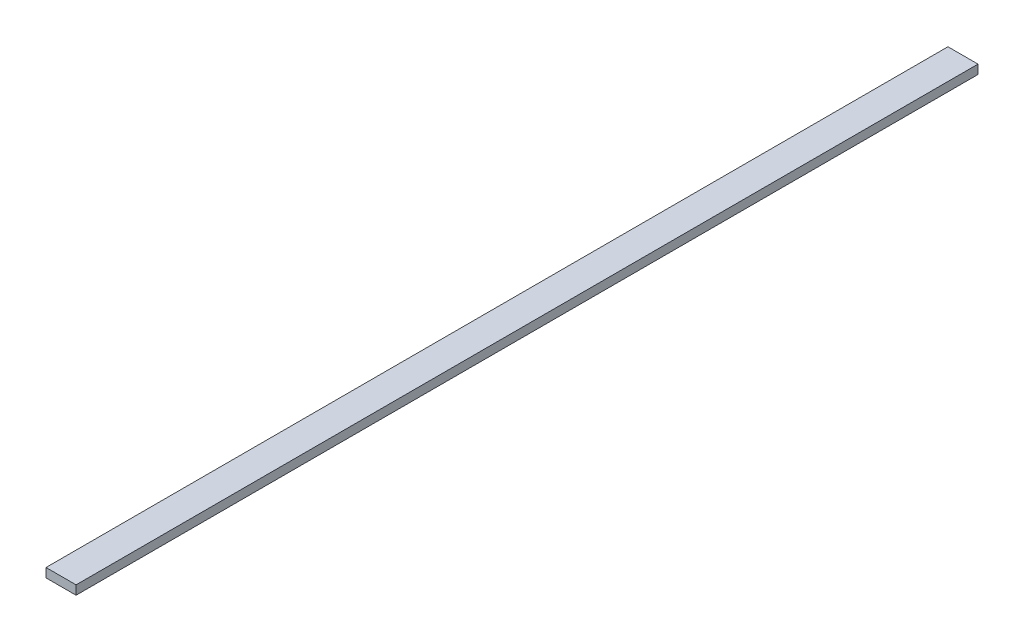
ISO-10303-21;
HEADER;
FILE_DESCRIPTION(('STEP AP214'),'2;1');
FILE_NAME('part.step','',(''),(''),'','','');
FILE_SCHEMA(('AUTOMOTIVE_DESIGN { 1 0 10303 214 1 1 1 1 }'));
ENDSEC;
DATA;
#1=APPLICATION_CONTEXT('core data for automotive mechanical design processes');
#2=APPLICATION_PROTOCOL_DEFINITION('international standard','automotive_design',2000,#1);
#3=PRODUCT_CONTEXT('',#1,'mechanical');
#4=PRODUCT('Part','Part','',(#3));
#5=PRODUCT_RELATED_PRODUCT_CATEGORY('part','',(#4));
#6=PRODUCT_DEFINITION_FORMATION('','',#4);
#7=PRODUCT_DEFINITION_CONTEXT('part definition',#1,'design');
#8=PRODUCT_DEFINITION('design','',#6,#7);
#9=PRODUCT_DEFINITION_SHAPE('','',#8);
#10=(LENGTH_UNIT() NAMED_UNIT(*) SI_UNIT(.MILLI.,.METRE.));
#11=(NAMED_UNIT(*) PLANE_ANGLE_UNIT() SI_UNIT($,.RADIAN.));
#12=(NAMED_UNIT(*) SI_UNIT($,.STERADIAN.) SOLID_ANGLE_UNIT());
#13=UNCERTAINTY_MEASURE_WITH_UNIT(LENGTH_MEASURE(1.E-05),#10,'distance_accuracy_value','');
#14=(GEOMETRIC_REPRESENTATION_CONTEXT(3) GLOBAL_UNCERTAINTY_ASSIGNED_CONTEXT((#13)) GLOBAL_UNIT_ASSIGNED_CONTEXT((#10,
#11,#12)) REPRESENTATION_CONTEXT('',''));
#15=CARTESIAN_POINT('',(0.,0.,0.));
#16=DIRECTION('',(0.,0.,1.));
#17=DIRECTION('',(1.,0.,0.));
#18=AXIS2_PLACEMENT_3D('',#15,#16,#17);
#19=CARTESIAN_POINT('',(-23.6537841965188,3.,-47.699620064803));
#20=DIRECTION('',(1.,0.,0.));
#21=DIRECTION('',(0.,0.,-1.));
#22=AXIS2_PLACEMENT_3D('',#19,#20,#21);
#23=PLANE('',#22);
#24=DIRECTION('',(0.,0.,1.));
#25=VECTOR('',#24,1.);
#26=CARTESIAN_POINT('',(-23.6537841965188,0.,-47.699620064803));
#27=LINE('',#26,#25);
#28=CARTESIAN_POINT('',(-23.6537841965188,0.,-47.699620064803));
#29=VERTEX_POINT('',#28);
#30=CARTESIAN_POINT('',(-23.6537841965188,0.,252.300379935197));
#31=VERTEX_POINT('',#30);
#32=EDGE_CURVE('E104',#29,#31,#27,.T.);
#33=ORIENTED_EDGE('',*,*,#32,.T.);
#34=DIRECTION('',(0.,-1.,0.));
#35=VECTOR('',#34,1.);
#36=CARTESIAN_POINT('',(-23.6537841965188,3.,252.300379935197));
#37=LINE('',#36,#35);
#38=CARTESIAN_POINT('',(-23.6537841965188,3.,252.300379935197));
#39=VERTEX_POINT('',#38);
#40=EDGE_CURVE('E11',#39,#31,#37,.T.);
#41=ORIENTED_EDGE('',*,*,#40,.F.);
#42=DIRECTION('',(0.,0.,1.));
#43=VECTOR('',#42,1.);
#44=CARTESIAN_POINT('',(-23.6537841965188,3.,-47.699620064803));
#45=LINE('',#44,#43);
#46=CARTESIAN_POINT('',(-23.6537841965188,3.,-47.699620064803));
#47=VERTEX_POINT('',#46);
#48=EDGE_CURVE('E92',#47,#39,#45,.T.);
#49=ORIENTED_EDGE('',*,*,#48,.F.);
#50=DIRECTION('',(0.,-1.,0.));
#51=VECTOR('',#50,1.);
#52=CARTESIAN_POINT('',(-23.6537841965188,3.,-47.699620064803));
#53=LINE('',#52,#51);
#54=EDGE_CURVE('E100',#47,#29,#53,.T.);
#55=ORIENTED_EDGE('',*,*,#54,.T.);
#56=EDGE_LOOP('',(#33,#41,#49,#55));
#57=FACE_BOUND('',#56,.T.);
#58=ADVANCED_FACE('F41',(#57),#23,.F.);
#59=CARTESIAN_POINT('',(-23.6537841965188,3.,252.300379935197));
#60=DIRECTION('',(0.,0.,-1.));
#61=DIRECTION('',(-1.,0.,0.));
#62=AXIS2_PLACEMENT_3D('',#59,#60,#61);
#63=PLANE('',#62);
#64=DIRECTION('',(1.,0.,0.));
#65=VECTOR('',#64,1.);
#66=CARTESIAN_POINT('',(-23.6537841965188,0.,252.300379935197));
#67=LINE('',#66,#65);
#68=CARTESIAN_POINT('',(-13.6537841965188,0.,252.300379935197));
#69=VERTEX_POINT('',#68);
#70=EDGE_CURVE('E96',#31,#69,#67,.T.);
#71=ORIENTED_EDGE('',*,*,#70,.T.);
#72=DIRECTION('',(0.,-1.,0.));
#73=VECTOR('',#72,1.);
#74=CARTESIAN_POINT('',(-13.6537841965188,3.,252.300379935197));
#75=LINE('',#74,#73);
#76=CARTESIAN_POINT('',(-13.6537841965188,3.,252.300379935197));
#77=VERTEX_POINT('',#76);
#78=EDGE_CURVE('E49',#77,#69,#75,.T.);
#79=ORIENTED_EDGE('',*,*,#78,.F.);
#80=DIRECTION('',(1.,0.,0.));
#81=VECTOR('',#80,1.);
#82=CARTESIAN_POINT('',(-23.6537841965188,3.,252.300379935197));
#83=LINE('',#82,#81);
#84=EDGE_CURVE('E87',#39,#77,#83,.T.);
#85=ORIENTED_EDGE('',*,*,#84,.F.);
#86=ORIENTED_EDGE('',*,*,#40,.T.);
#87=EDGE_LOOP('',(#71,#79,#85,#86));
#88=FACE_BOUND('',#87,.T.);
#89=ADVANCED_FACE('F95',(#88),#63,.F.);
#90=CARTESIAN_POINT('',(-13.6537841965188,3.,-47.699620064803));
#91=DIRECTION('',(-1.,0.,0.));
#92=DIRECTION('',(0.,0.,1.));
#93=AXIS2_PLACEMENT_3D('',#90,#91,#92);
#94=PLANE('',#93);
#95=DIRECTION('',(0.,0.,-1.));
#96=VECTOR('',#95,1.);
#97=CARTESIAN_POINT('',(-13.6537841965188,0.,-47.699620064803));
#98=LINE('',#97,#96);
#99=CARTESIAN_POINT('',(-13.6537841965188,0.,-47.699620064803));
#100=VERTEX_POINT('',#99);
#101=EDGE_CURVE('E74',#69,#100,#98,.T.);
#102=ORIENTED_EDGE('',*,*,#101,.T.);
#103=DIRECTION('',(0.,-1.,0.));
#104=VECTOR('',#103,1.);
#105=CARTESIAN_POINT('',(-13.6537841965188,3.,-47.699620064803));
#106=LINE('',#105,#104);
#107=CARTESIAN_POINT('',(-13.6537841965188,3.,-47.699620064803));
#108=VERTEX_POINT('',#107);
#109=EDGE_CURVE('E97',#108,#100,#106,.T.);
#110=ORIENTED_EDGE('',*,*,#109,.F.);
#111=DIRECTION('',(0.,0.,-1.));
#112=VECTOR('',#111,1.);
#113=CARTESIAN_POINT('',(-13.6537841965188,3.,-47.699620064803));
#114=LINE('',#113,#112);
#115=EDGE_CURVE('E90',#77,#108,#114,.T.);
#116=ORIENTED_EDGE('',*,*,#115,.F.);
#117=ORIENTED_EDGE('',*,*,#78,.T.);
#118=EDGE_LOOP('',(#102,#110,#116,#117));
#119=FACE_BOUND('',#118,.T.);
#120=ADVANCED_FACE('F98',(#119),#94,.F.);
#121=CARTESIAN_POINT('',(-23.6537841965188,3.,-47.699620064803));
#122=DIRECTION('',(0.,0.,1.));
#123=DIRECTION('',(1.,0.,0.));
#124=AXIS2_PLACEMENT_3D('',#121,#122,#123);
#125=PLANE('',#124);
#126=DIRECTION('',(-1.,0.,0.));
#127=VECTOR('',#126,1.);
#128=CARTESIAN_POINT('',(-23.6537841965188,0.,-47.699620064803));
#129=LINE('',#128,#127);
#130=EDGE_CURVE('E80',#100,#29,#129,.T.);
#131=ORIENTED_EDGE('',*,*,#130,.T.);
#132=ORIENTED_EDGE('',*,*,#54,.F.);
#133=DIRECTION('',(-1.,0.,0.));
#134=VECTOR('',#133,1.);
#135=CARTESIAN_POINT('',(-23.6537841965188,3.,-47.699620064803));
#136=LINE('',#135,#134);
#137=EDGE_CURVE('E57',#108,#47,#136,.T.);
#138=ORIENTED_EDGE('',*,*,#137,.F.);
#139=ORIENTED_EDGE('',*,*,#109,.T.);
#140=EDGE_LOOP('',(#131,#132,#138,#139));
#141=FACE_BOUND('',#140,.T.);
#142=ADVANCED_FACE('F111',(#141),#125,.F.);
#143=CARTESIAN_POINT('',(0.,3.,0.));
#144=DIRECTION('',(0.,1.,0.));
#145=DIRECTION('',(0.,0.,1.));
#146=AXIS2_PLACEMENT_3D('',#143,#144,#145);
#147=PLANE('',#146);
#148=ORIENTED_EDGE('',*,*,#48,.T.);
#149=ORIENTED_EDGE('',*,*,#84,.T.);
#150=ORIENTED_EDGE('',*,*,#115,.T.);
#151=ORIENTED_EDGE('',*,*,#137,.T.);
#152=EDGE_LOOP('',(#148,#149,#150,#151));
#153=FACE_BOUND('',#152,.T.);
#154=ADVANCED_FACE('F88',(#153),#147,.T.);
#155=CARTESIAN_POINT('',(0.,0.,0.));
#156=DIRECTION('',(0.,1.,0.));
#157=DIRECTION('',(0.,0.,1.));
#158=AXIS2_PLACEMENT_3D('',#155,#156,#157);
#159=PLANE('',#158);
#160=ORIENTED_EDGE('',*,*,#32,.F.);
#161=ORIENTED_EDGE('',*,*,#130,.F.);
#162=ORIENTED_EDGE('',*,*,#101,.F.);
#163=ORIENTED_EDGE('',*,*,#70,.F.);
#164=EDGE_LOOP('',(#160,#161,#162,#163));
#165=FACE_BOUND('',#164,.T.);
#166=ADVANCED_FACE('F114',(#165),#159,.F.);
#167=CLOSED_SHELL('',(#58,#89,#120,#142,#154,#166));
#168=MANIFOLD_SOLID_BREP('B2',#167);
#169=ADVANCED_BREP_SHAPE_REPRESENTATION('',(#18,#168),#14);
#170=SHAPE_DEFINITION_REPRESENTATION(#9,#169);
ENDSEC;
END-ISO-10303-21;
